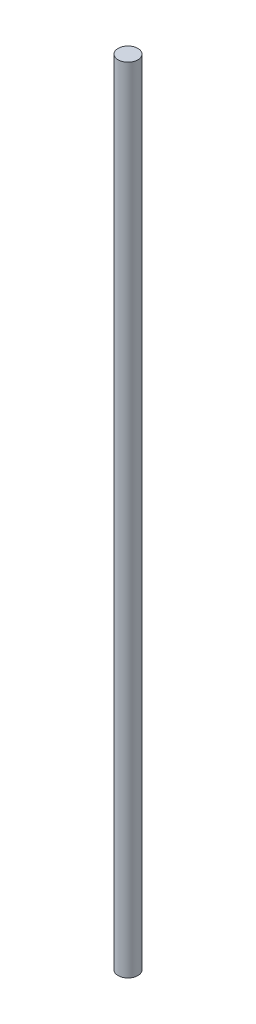
ISO-10303-21;
HEADER;
FILE_DESCRIPTION(('STEP AP214'),'2;1');
FILE_NAME('part.step','',(''),(''),'','','');
FILE_SCHEMA(('AUTOMOTIVE_DESIGN { 1 0 10303 214 1 1 1 1 }'));
ENDSEC;
DATA;
#1=APPLICATION_CONTEXT('core data for automotive mechanical design processes');
#2=APPLICATION_PROTOCOL_DEFINITION('international standard','automotive_design',2000,#1);
#3=PRODUCT_CONTEXT('',#1,'mechanical');
#4=PRODUCT('Part','Part','',(#3));
#5=PRODUCT_RELATED_PRODUCT_CATEGORY('part','',(#4));
#6=PRODUCT_DEFINITION_FORMATION('','',#4);
#7=PRODUCT_DEFINITION_CONTEXT('part definition',#1,'design');
#8=PRODUCT_DEFINITION('design','',#6,#7);
#9=PRODUCT_DEFINITION_SHAPE('','',#8);
#10=(LENGTH_UNIT() NAMED_UNIT(*) SI_UNIT(.MILLI.,.METRE.));
#11=(NAMED_UNIT(*) PLANE_ANGLE_UNIT() SI_UNIT($,.RADIAN.));
#12=(NAMED_UNIT(*) SI_UNIT($,.STERADIAN.) SOLID_ANGLE_UNIT());
#13=UNCERTAINTY_MEASURE_WITH_UNIT(LENGTH_MEASURE(1.E-05),#10,'distance_accuracy_value','');
#14=(GEOMETRIC_REPRESENTATION_CONTEXT(3) GLOBAL_UNCERTAINTY_ASSIGNED_CONTEXT((#13)) GLOBAL_UNIT_ASSIGNED_CONTEXT((#10,
#11,#12)) REPRESENTATION_CONTEXT('',''));
#15=CARTESIAN_POINT('',(0.,0.,0.));
#16=DIRECTION('',(0.,0.,1.));
#17=DIRECTION('',(1.,0.,0.));
#18=AXIS2_PLACEMENT_3D('',#15,#16,#17);
#19=CARTESIAN_POINT('',(0.,800.,0.));
#20=DIRECTION('',(0.,-1.,0.));
#21=DIRECTION('',(0.,0.,-1.));
#22=AXIS2_PLACEMENT_3D('',#19,#20,#21);
#23=CYLINDRICAL_SURFACE('',#22,10.);
#24=CARTESIAN_POINT('',(0.,800.,0.));
#25=DIRECTION('',(0.,1.,0.));
#26=DIRECTION('',(0.,0.,1.));
#27=AXIS2_PLACEMENT_3D('',#24,#25,#26);
#28=CIRCLE('',#27,10.);
#29=CARTESIAN_POINT('',(0.,800.,10.));
#30=VERTEX_POINT('',#29);
#31=EDGE_CURVE('E10',#30,#30,#28,.T.);
#32=ORIENTED_EDGE('',*,*,#31,.F.);
#33=EDGE_LOOP('',(#32));
#34=FACE_BOUND('',#33,.T.);
#35=CARTESIAN_POINT('',(0.,0.,0.));
#36=DIRECTION('',(0.,1.,0.));
#37=DIRECTION('',(0.,0.,1.));
#38=AXIS2_PLACEMENT_3D('',#35,#36,#37);
#39=CIRCLE('',#38,10.);
#40=CARTESIAN_POINT('',(0.,0.,10.));
#41=VERTEX_POINT('',#40);
#42=EDGE_CURVE('E34',#41,#41,#39,.T.);
#43=ORIENTED_EDGE('',*,*,#42,.T.);
#44=EDGE_LOOP('',(#43));
#45=FACE_BOUND('',#44,.T.);
#46=ADVANCED_FACE('F31',(#34,#45),#23,.T.);
#47=CARTESIAN_POINT('',(0.,800.,0.));
#48=DIRECTION('',(0.,1.,0.));
#49=DIRECTION('',(0.,0.,1.));
#50=AXIS2_PLACEMENT_3D('',#47,#48,#49);
#51=PLANE('',#50);
#52=ORIENTED_EDGE('',*,*,#31,.T.);
#53=EDGE_LOOP('',(#52));
#54=FACE_BOUND('',#53,.T.);
#55=ADVANCED_FACE('F46',(#54),#51,.T.);
#56=CARTESIAN_POINT('',(0.,0.,0.));
#57=DIRECTION('',(0.,1.,0.));
#58=DIRECTION('',(0.,0.,1.));
#59=AXIS2_PLACEMENT_3D('',#56,#57,#58);
#60=PLANE('',#59);
#61=ORIENTED_EDGE('',*,*,#42,.F.);
#62=EDGE_LOOP('',(#61));
#63=FACE_BOUND('',#62,.T.);
#64=ADVANCED_FACE('F44',(#63),#60,.F.);
#65=CLOSED_SHELL('',(#46,#55,#64));
#66=MANIFOLD_SOLID_BREP('B2',#65);
#67=ADVANCED_BREP_SHAPE_REPRESENTATION('',(#18,#66),#14);
#68=SHAPE_DEFINITION_REPRESENTATION(#9,#67);
ENDSEC;
END-ISO-10303-21;
